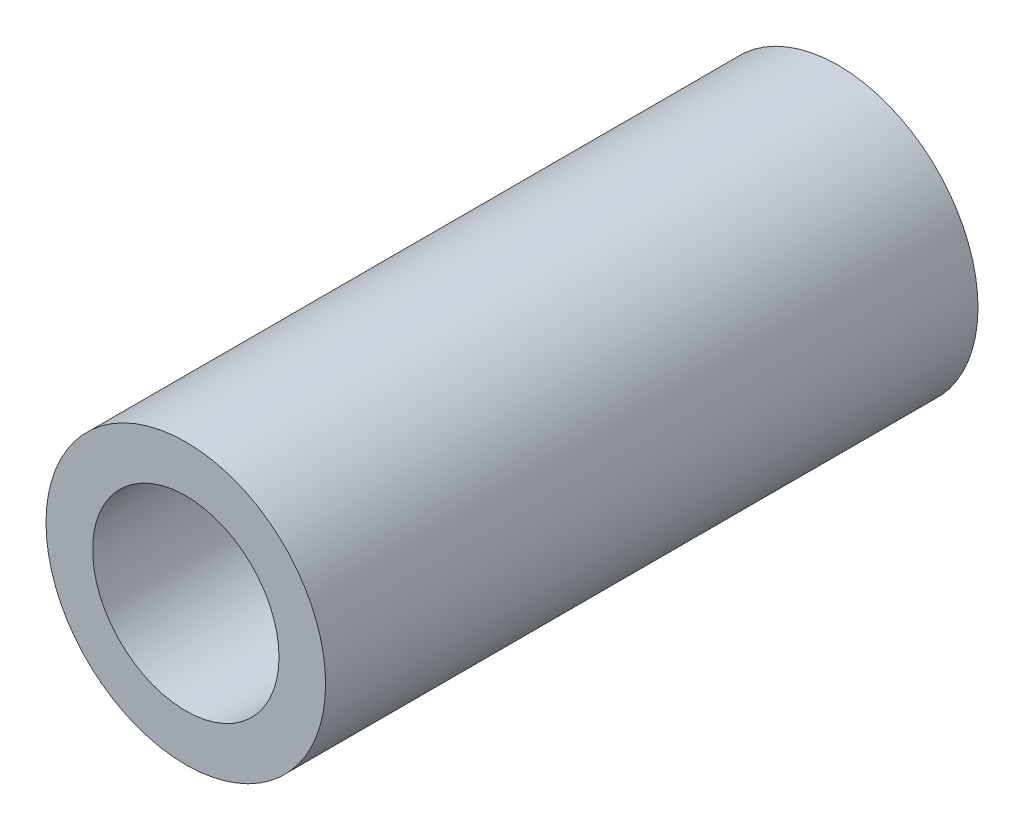
ISO-10303-21;
HEADER;
FILE_DESCRIPTION(('STEP AP214'),'2;1');
FILE_NAME('part.step','',(''),(''),'','','');
FILE_SCHEMA(('AUTOMOTIVE_DESIGN { 1 0 10303 214 1 1 1 1 }'));
ENDSEC;
DATA;
#1=APPLICATION_CONTEXT('core data for automotive mechanical design processes');
#2=APPLICATION_PROTOCOL_DEFINITION('international standard','automotive_design',2000,#1);
#3=PRODUCT_CONTEXT('',#1,'mechanical');
#4=PRODUCT('Part','Part','',(#3));
#5=PRODUCT_RELATED_PRODUCT_CATEGORY('part','',(#4));
#6=PRODUCT_DEFINITION_FORMATION('','',#4);
#7=PRODUCT_DEFINITION_CONTEXT('part definition',#1,'design');
#8=PRODUCT_DEFINITION('design','',#6,#7);
#9=PRODUCT_DEFINITION_SHAPE('','',#8);
#10=(LENGTH_UNIT() NAMED_UNIT(*) SI_UNIT(.MILLI.,.METRE.));
#11=(NAMED_UNIT(*) PLANE_ANGLE_UNIT() SI_UNIT($,.RADIAN.));
#12=(NAMED_UNIT(*) SI_UNIT($,.STERADIAN.) SOLID_ANGLE_UNIT());
#13=UNCERTAINTY_MEASURE_WITH_UNIT(LENGTH_MEASURE(1.E-05),#10,'distance_accuracy_value','');
#14=(GEOMETRIC_REPRESENTATION_CONTEXT(3) GLOBAL_UNCERTAINTY_ASSIGNED_CONTEXT((#13)) GLOBAL_UNIT_ASSIGNED_CONTEXT((#10,
#11,#12)) REPRESENTATION_CONTEXT('',''));
#15=CARTESIAN_POINT('',(0.,0.,0.));
#16=DIRECTION('',(0.,0.,1.));
#17=DIRECTION('',(1.,0.,0.));
#18=AXIS2_PLACEMENT_3D('',#15,#16,#17);
#19=CARTESIAN_POINT('',(0.,0.,14.));
#20=DIRECTION('',(0.,0.,1.));
#21=DIRECTION('',(1.,0.,0.));
#22=AXIS2_PLACEMENT_3D('',#19,#20,#21);
#23=PLANE('',#22);
#24=CARTESIAN_POINT('',(0.,0.,14.));
#25=DIRECTION('',(0.,0.,1.));
#26=DIRECTION('',(1.,0.,0.));
#27=AXIS2_PLACEMENT_3D('',#24,#25,#26);
#28=CIRCLE('',#27,3.);
#29=CARTESIAN_POINT('',(3.,0.,14.));
#30=VERTEX_POINT('',#29);
#31=EDGE_CURVE('E10',#30,#30,#28,.T.);
#32=ORIENTED_EDGE('',*,*,#31,.T.);
#33=EDGE_LOOP('',(#32));
#34=FACE_BOUND('',#33,.T.);
#35=CARTESIAN_POINT('',(0.,0.,14.));
#36=DIRECTION('',(0.,0.,1.));
#37=DIRECTION('',(1.,0.,0.));
#38=AXIS2_PLACEMENT_3D('',#35,#36,#37);
#39=CIRCLE('',#38,2.);
#40=CARTESIAN_POINT('',(2.,0.,14.));
#41=VERTEX_POINT('',#40);
#42=EDGE_CURVE('E41',#41,#41,#39,.T.);
#43=ORIENTED_EDGE('',*,*,#42,.F.);
#44=EDGE_LOOP('',(#43));
#45=FACE_BOUND('',#44,.T.);
#46=ADVANCED_FACE('F30',(#34,#45),#23,.T.);
#47=CARTESIAN_POINT('',(0.,0.,0.));
#48=DIRECTION('',(0.,0.,1.));
#49=DIRECTION('',(1.,0.,0.));
#50=AXIS2_PLACEMENT_3D('',#47,#48,#49);
#51=PLANE('',#50);
#52=CARTESIAN_POINT('',(0.,0.,0.));
#53=DIRECTION('',(0.,0.,1.));
#54=DIRECTION('',(1.,0.,0.));
#55=AXIS2_PLACEMENT_3D('',#52,#53,#54);
#56=CIRCLE('',#55,3.);
#57=CARTESIAN_POINT('',(3.,0.,0.));
#58=VERTEX_POINT('',#57);
#59=EDGE_CURVE('E34',#58,#58,#56,.T.);
#60=ORIENTED_EDGE('',*,*,#59,.F.);
#61=EDGE_LOOP('',(#60));
#62=FACE_BOUND('',#61,.T.);
#63=CARTESIAN_POINT('',(0.,0.,0.));
#64=DIRECTION('',(0.,0.,1.));
#65=DIRECTION('',(1.,0.,0.));
#66=AXIS2_PLACEMENT_3D('',#63,#64,#65);
#67=CIRCLE('',#66,2.);
#68=CARTESIAN_POINT('',(2.,0.,0.));
#69=VERTEX_POINT('',#68);
#70=EDGE_CURVE('E43',#69,#69,#67,.T.);
#71=ORIENTED_EDGE('',*,*,#70,.T.);
#72=EDGE_LOOP('',(#71));
#73=FACE_BOUND('',#72,.T.);
#74=ADVANCED_FACE('F53',(#62,#73),#51,.F.);
#75=CARTESIAN_POINT('',(0.,0.,14.));
#76=DIRECTION('',(0.,0.,-1.));
#77=DIRECTION('',(-1.,0.,0.));
#78=AXIS2_PLACEMENT_3D('',#75,#76,#77);
#79=CYLINDRICAL_SURFACE('',#78,3.);
#80=ORIENTED_EDGE('',*,*,#31,.F.);
#81=EDGE_LOOP('',(#80));
#82=FACE_BOUND('',#81,.T.);
#83=ORIENTED_EDGE('',*,*,#59,.T.);
#84=EDGE_LOOP('',(#83));
#85=FACE_BOUND('',#84,.T.);
#86=ADVANCED_FACE('F32',(#82,#85),#79,.T.);
#87=CARTESIAN_POINT('',(0.,0.,14.));
#88=DIRECTION('',(0.,0.,-1.));
#89=DIRECTION('',(-1.,0.,0.));
#90=AXIS2_PLACEMENT_3D('',#87,#88,#89);
#91=CYLINDRICAL_SURFACE('',#90,2.);
#92=ORIENTED_EDGE('',*,*,#42,.T.);
#93=EDGE_LOOP('',(#92));
#94=FACE_BOUND('',#93,.T.);
#95=ORIENTED_EDGE('',*,*,#70,.F.);
#96=EDGE_LOOP('',(#95));
#97=FACE_BOUND('',#96,.T.);
#98=ADVANCED_FACE('F49',(#94,#97),#91,.F.);
#99=CLOSED_SHELL('',(#46,#74,#86,#98));
#100=MANIFOLD_SOLID_BREP('B2',#99);
#101=ADVANCED_BREP_SHAPE_REPRESENTATION('',(#18,#100),#14);
#102=SHAPE_DEFINITION_REPRESENTATION(#9,#101);
ENDSEC;
END-ISO-10303-21;
